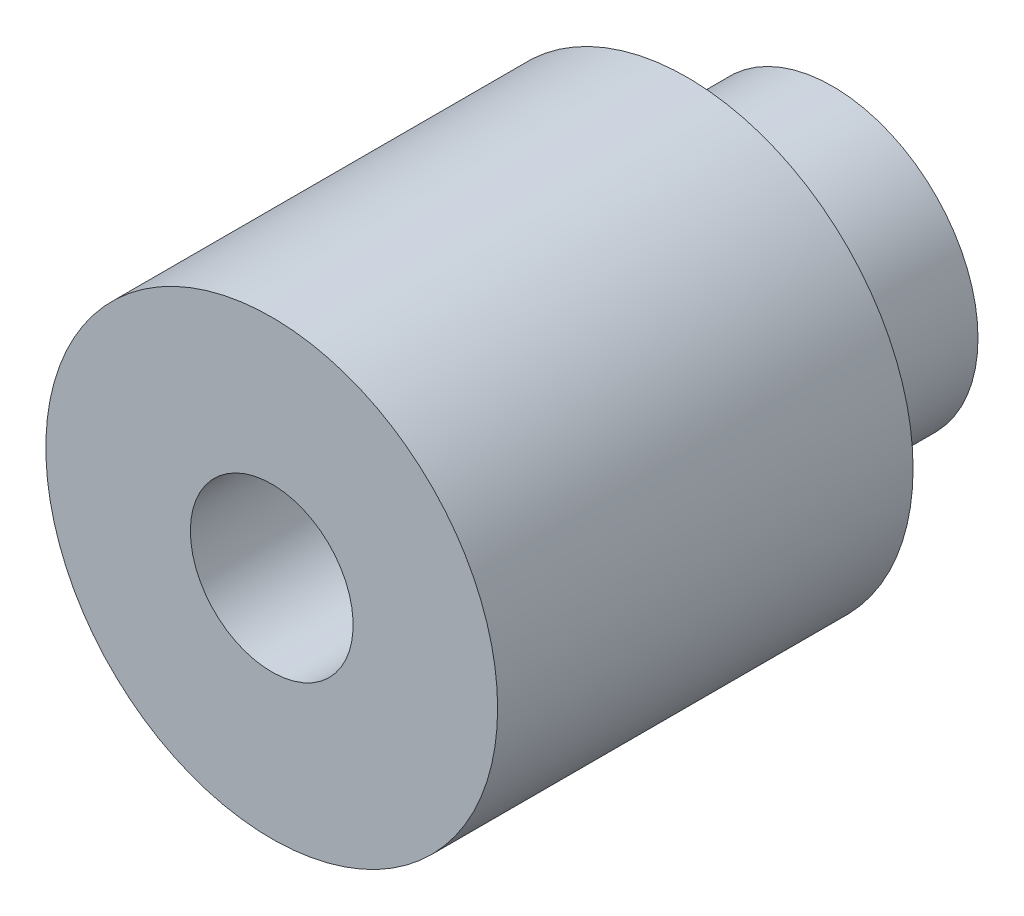
ISO-10303-21;
HEADER;
FILE_DESCRIPTION(('STEP AP214'),'2;1');
FILE_NAME('part.step','',(''),(''),'','','');
FILE_SCHEMA(('AUTOMOTIVE_DESIGN { 1 0 10303 214 1 1 1 1 }'));
ENDSEC;
DATA;
#1=APPLICATION_CONTEXT('core data for automotive mechanical design processes');
#2=APPLICATION_PROTOCOL_DEFINITION('international standard','automotive_design',2000,#1);
#3=PRODUCT_CONTEXT('',#1,'mechanical');
#4=PRODUCT('Part','Part','',(#3));
#5=PRODUCT_RELATED_PRODUCT_CATEGORY('part','',(#4));
#6=PRODUCT_DEFINITION_FORMATION('','',#4);
#7=PRODUCT_DEFINITION_CONTEXT('part definition',#1,'design');
#8=PRODUCT_DEFINITION('design','',#6,#7);
#9=PRODUCT_DEFINITION_SHAPE('','',#8);
#10=(LENGTH_UNIT() NAMED_UNIT(*) SI_UNIT(.MILLI.,.METRE.));
#11=(NAMED_UNIT(*) PLANE_ANGLE_UNIT() SI_UNIT($,.RADIAN.));
#12=(NAMED_UNIT(*) SI_UNIT($,.STERADIAN.) SOLID_ANGLE_UNIT());
#13=UNCERTAINTY_MEASURE_WITH_UNIT(LENGTH_MEASURE(1.E-05),#10,'distance_accuracy_value','');
#14=(GEOMETRIC_REPRESENTATION_CONTEXT(3) GLOBAL_UNCERTAINTY_ASSIGNED_CONTEXT((#13)) GLOBAL_UNIT_ASSIGNED_CONTEXT((#10,
#11,#12)) REPRESENTATION_CONTEXT('',''));
#15=CARTESIAN_POINT('',(0.,0.,0.));
#16=DIRECTION('',(0.,0.,1.));
#17=DIRECTION('',(1.,0.,0.));
#18=AXIS2_PLACEMENT_3D('',#15,#16,#17);
#19=CARTESIAN_POINT('',(-1.4,0.,0.));
#20=DIRECTION('',(0.,0.,1.));
#21=DIRECTION('',(1.,0.,0.));
#22=AXIS2_PLACEMENT_3D('',#19,#20,#21);
#23=PLANE('',#22);
#24=CARTESIAN_POINT('',(0.,0.,0.));
#25=DIRECTION('',(0.,0.,1.));
#26=DIRECTION('',(1.,0.,0.));
#27=AXIS2_PLACEMENT_3D('',#24,#25,#26);
#28=CIRCLE('',#27,1.4);
#29=CARTESIAN_POINT('',(1.4,0.,0.));
#30=VERTEX_POINT('',#29);
#31=EDGE_CURVE('E18',#30,#30,#28,.T.);
#32=ORIENTED_EDGE('',*,*,#31,.F.);
#33=EDGE_LOOP('',(#32));
#34=FACE_BOUND('',#33,.T.);
#35=CARTESIAN_POINT('',(0.,0.,0.));
#36=DIRECTION('',(0.,0.,-1.));
#37=DIRECTION('',(-1.,0.,0.));
#38=AXIS2_PLACEMENT_3D('',#35,#36,#37);
#39=CIRCLE('',#38,0.7835);
#40=CARTESIAN_POINT('',(-0.7835,0.,0.));
#41=VERTEX_POINT('',#40);
#42=EDGE_CURVE('E34',#41,#41,#39,.F.);
#43=ORIENTED_EDGE('',*,*,#42,.T.);
#44=EDGE_LOOP('',(#43));
#45=FACE_BOUND('',#44,.T.);
#46=ADVANCED_FACE('F15',(#34,#45),#23,.F.);
#47=CARTESIAN_POINT('',(0.,0.,0.));
#48=DIRECTION('',(0.,0.,1.));
#49=DIRECTION('',(1.,0.,0.));
#50=AXIS2_PLACEMENT_3D('',#47,#48,#49);
#51=CYLINDRICAL_SURFACE('',#50,1.4);
#52=CARTESIAN_POINT('',(0.,0.,1.4));
#53=DIRECTION('',(0.,0.,1.));
#54=DIRECTION('',(1.,0.,0.));
#55=AXIS2_PLACEMENT_3D('',#52,#53,#54);
#56=CIRCLE('',#55,1.4);
#57=CARTESIAN_POINT('',(1.4,0.,1.4));
#58=VERTEX_POINT('',#57);
#59=EDGE_CURVE('E32',#58,#58,#56,.F.);
#60=ORIENTED_EDGE('',*,*,#59,.T.);
#61=EDGE_LOOP('',(#60));
#62=FACE_BOUND('',#61,.T.);
#63=ORIENTED_EDGE('',*,*,#31,.T.);
#64=EDGE_LOOP('',(#63));
#65=FACE_BOUND('',#64,.T.);
#66=ADVANCED_FACE('F41',(#62,#65),#51,.T.);
#67=CARTESIAN_POINT('',(0.,0.,-2.785658189785));
#68=DIRECTION('',(0.,0.,-1.));
#69=DIRECTION('',(-1.,0.,0.));
#70=AXIS2_PLACEMENT_3D('',#67,#68,#69);
#71=CYLINDRICAL_SURFACE('',#70,0.7835);
#72=CARTESIAN_POINT('',(0.,0.,5.4));
#73=DIRECTION('',(0.,0.,-1.));
#74=DIRECTION('',(-1.,0.,0.));
#75=AXIS2_PLACEMENT_3D('',#72,#73,#74);
#76=CIRCLE('',#75,0.7835);
#77=CARTESIAN_POINT('',(-0.7835,0.,5.4));
#78=VERTEX_POINT('',#77);
#79=EDGE_CURVE('E27',#78,#78,#76,.F.);
#80=ORIENTED_EDGE('',*,*,#79,.T.);
#81=EDGE_LOOP('',(#80));
#82=FACE_BOUND('',#81,.T.);
#83=ORIENTED_EDGE('',*,*,#42,.F.);
#84=EDGE_LOOP('',(#83));
#85=FACE_BOUND('',#84,.T.);
#86=ADVANCED_FACE('F48',(#82,#85),#71,.F.);
#87=CARTESIAN_POINT('',(-2.175,0.,1.4));
#88=DIRECTION('',(0.,0.,1.));
#89=DIRECTION('',(1.,0.,0.));
#90=AXIS2_PLACEMENT_3D('',#87,#88,#89);
#91=PLANE('',#90);
#92=CARTESIAN_POINT('',(0.,0.,1.4));
#93=DIRECTION('',(0.,0.,1.));
#94=DIRECTION('',(1.,0.,0.));
#95=AXIS2_PLACEMENT_3D('',#92,#93,#94);
#96=CIRCLE('',#95,2.175);
#97=CARTESIAN_POINT('',(2.175,0.,1.4));
#98=VERTEX_POINT('',#97);
#99=EDGE_CURVE('E22',#98,#98,#96,.T.);
#100=ORIENTED_EDGE('',*,*,#99,.F.);
#101=EDGE_LOOP('',(#100));
#102=FACE_BOUND('',#101,.T.);
#103=ORIENTED_EDGE('',*,*,#59,.F.);
#104=EDGE_LOOP('',(#103));
#105=FACE_BOUND('',#104,.T.);
#106=ADVANCED_FACE('F57',(#102,#105),#91,.F.);
#107=CARTESIAN_POINT('',(0.,0.,5.4));
#108=DIRECTION('',(0.,0.,-1.));
#109=DIRECTION('',(-1.,0.,0.));
#110=AXIS2_PLACEMENT_3D('',#107,#108,#109);
#111=PLANE('',#110);
#112=CARTESIAN_POINT('',(0.,0.,5.4));
#113=DIRECTION('',(0.,0.,1.));
#114=DIRECTION('',(1.,0.,0.));
#115=AXIS2_PLACEMENT_3D('',#112,#113,#114);
#116=CIRCLE('',#115,2.175);
#117=CARTESIAN_POINT('',(2.175,0.,5.4));
#118=VERTEX_POINT('',#117);
#119=EDGE_CURVE('E10',#118,#118,#116,.F.);
#120=ORIENTED_EDGE('',*,*,#119,.F.);
#121=EDGE_LOOP('',(#120));
#122=FACE_BOUND('',#121,.T.);
#123=ORIENTED_EDGE('',*,*,#79,.F.);
#124=EDGE_LOOP('',(#123));
#125=FACE_BOUND('',#124,.T.);
#126=ADVANCED_FACE('F52',(#122,#125),#111,.F.);
#127=CARTESIAN_POINT('',(0.,0.,0.));
#128=DIRECTION('',(0.,0.,1.));
#129=DIRECTION('',(1.,0.,0.));
#130=AXIS2_PLACEMENT_3D('',#127,#128,#129);
#131=CYLINDRICAL_SURFACE('',#130,2.175);
#132=ORIENTED_EDGE('',*,*,#119,.T.);
#133=EDGE_LOOP('',(#132));
#134=FACE_BOUND('',#133,.T.);
#135=ORIENTED_EDGE('',*,*,#99,.T.);
#136=EDGE_LOOP('',(#135));
#137=FACE_BOUND('',#136,.T.);
#138=ADVANCED_FACE('F50',(#134,#137),#131,.T.);
#139=CLOSED_SHELL('',(#46,#66,#86,#106,#126,#138));
#140=MANIFOLD_SOLID_BREP('B1',#139);
#141=ADVANCED_BREP_SHAPE_REPRESENTATION('',(#18,#140),#14);
#142=SHAPE_DEFINITION_REPRESENTATION(#9,#141);
ENDSEC;
END-ISO-10303-21;
